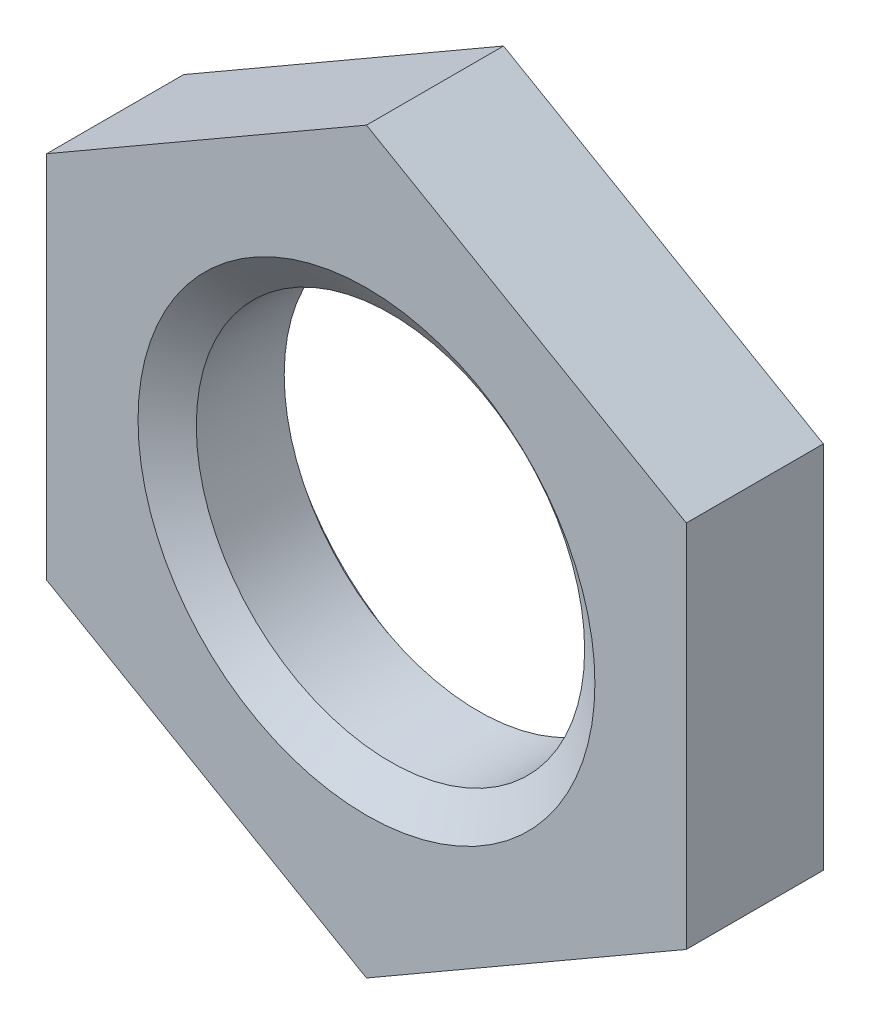
ISO-10303-21;
HEADER;
FILE_DESCRIPTION(('STEP AP214'),'2;1');
FILE_NAME('part.step','',(''),(''),'','','');
FILE_SCHEMA(('AUTOMOTIVE_DESIGN { 1 0 10303 214 1 1 1 1 }'));
ENDSEC;
DATA;
#1=APPLICATION_CONTEXT('core data for automotive mechanical design processes');
#2=APPLICATION_PROTOCOL_DEFINITION('international standard','automotive_design',2000,#1);
#3=PRODUCT_CONTEXT('',#1,'mechanical');
#4=PRODUCT('Part','Part','',(#3));
#5=PRODUCT_RELATED_PRODUCT_CATEGORY('part','',(#4));
#6=PRODUCT_DEFINITION_FORMATION('','',#4);
#7=PRODUCT_DEFINITION_CONTEXT('part definition',#1,'design');
#8=PRODUCT_DEFINITION('design','',#6,#7);
#9=PRODUCT_DEFINITION_SHAPE('','',#8);
#10=(LENGTH_UNIT() NAMED_UNIT(*) SI_UNIT(.MILLI.,.METRE.));
#11=(NAMED_UNIT(*) PLANE_ANGLE_UNIT() SI_UNIT($,.RADIAN.));
#12=(NAMED_UNIT(*) SI_UNIT($,.STERADIAN.) SOLID_ANGLE_UNIT());
#13=UNCERTAINTY_MEASURE_WITH_UNIT(LENGTH_MEASURE(1.E-05),#10,'distance_accuracy_value','');
#14=(GEOMETRIC_REPRESENTATION_CONTEXT(3) GLOBAL_UNCERTAINTY_ASSIGNED_CONTEXT((#13)) GLOBAL_UNIT_ASSIGNED_CONTEXT((#10,
#11,#12)) REPRESENTATION_CONTEXT('',''));
#15=CARTESIAN_POINT('',(0.,0.,0.));
#16=DIRECTION('',(0.,0.,1.));
#17=DIRECTION('',(1.,0.,0.));
#18=AXIS2_PLACEMENT_3D('',#15,#16,#17);
#19=CARTESIAN_POINT('',(0.,0.,-3.));
#20=DIRECTION('',(0.,0.,1.));
#21=DIRECTION('',(1.,0.,0.));
#22=AXIS2_PLACEMENT_3D('',#19,#20,#21);
#23=CYLINDRICAL_SURFACE('',#22,4.25);
#24=CARTESIAN_POINT('',(0.,0.,-0.525155653657273));
#25=DIRECTION('',(0.,0.,1.));
#26=DIRECTION('',(1.,0.,0.));
#27=AXIS2_PLACEMENT_3D('',#24,#25,#26);
#28=CIRCLE('',#27,4.25);
#29=CARTESIAN_POINT('',(4.25,0.,-0.525155653657273));
#30=VERTEX_POINT('',#29);
#31=EDGE_CURVE('E116',#30,#30,#28,.F.);
#32=ORIENTED_EDGE('',*,*,#31,.F.);
#33=EDGE_LOOP('',(#32));
#34=FACE_BOUND('',#33,.T.);
#35=CARTESIAN_POINT('',(0.,0.,-2.44944434634271));
#36=DIRECTION('',(0.,0.,-1.));
#37=DIRECTION('',(-1.,0.,0.));
#38=AXIS2_PLACEMENT_3D('',#35,#36,#37);
#39=CIRCLE('',#38,4.25);
#40=CARTESIAN_POINT('',(-4.25,0.,-2.44944434634271));
#41=VERTEX_POINT('',#40);
#42=EDGE_CURVE('E45',#41,#41,#39,.F.);
#43=ORIENTED_EDGE('',*,*,#42,.F.);
#44=EDGE_LOOP('',(#43));
#45=FACE_BOUND('',#44,.T.);
#46=ADVANCED_FACE('F41',(#34,#45),#23,.F.);
#47=CARTESIAN_POINT('',(0.,8.08290376865476,-3.));
#48=DIRECTION('',(0.,0.,-1.));
#49=DIRECTION('',(-1.,0.,0.));
#50=AXIS2_PLACEMENT_3D('',#47,#48,#49);
#51=PLANE('',#50);
#52=DIRECTION('',(-0.866025403784438,-0.500000000000001,0.));
#53=VECTOR('',#52,1.);
#54=CARTESIAN_POINT('',(0.,8.08290376865476,-3.));
#55=LINE('',#54,#53);
#56=CARTESIAN_POINT('',(0.,8.08290376865476,-3.));
#57=VERTEX_POINT('',#56);
#58=CARTESIAN_POINT('',(-7.,4.04145188432738,-3.));
#59=VERTEX_POINT('',#58);
#60=EDGE_CURVE('E97',#57,#59,#55,.T.);
#61=ORIENTED_EDGE('',*,*,#60,.F.);
#62=DIRECTION('',(-0.866025403784438,0.500000000000001,0.));
#63=VECTOR('',#62,1.);
#64=CARTESIAN_POINT('',(7.,4.04145188432737,-3.));
#65=LINE('',#64,#63);
#66=CARTESIAN_POINT('',(7.,4.04145188432737,-3.));
#67=VERTEX_POINT('',#66);
#68=EDGE_CURVE('E102',#67,#57,#65,.T.);
#69=ORIENTED_EDGE('',*,*,#68,.F.);
#70=DIRECTION('',(0.,-1.,0.));
#71=VECTOR('',#70,1.);
#72=CARTESIAN_POINT('',(7.,4.04145188432737,-3.));
#73=LINE('',#72,#71);
#74=CARTESIAN_POINT('',(7.,-4.04145188432739,-3.));
#75=VERTEX_POINT('',#74);
#76=EDGE_CURVE('E141',#67,#75,#73,.T.);
#77=ORIENTED_EDGE('',*,*,#76,.T.);
#78=DIRECTION('',(0.866025403784438,0.500000000000001,0.));
#79=VECTOR('',#78,1.);
#80=CARTESIAN_POINT('',(0.,-8.08290376865478,-3.));
#81=LINE('',#80,#79);
#82=CARTESIAN_POINT('',(0.,-8.08290376865478,-3.));
#83=VERTEX_POINT('',#82);
#84=EDGE_CURVE('E138',#83,#75,#81,.T.);
#85=ORIENTED_EDGE('',*,*,#84,.F.);
#86=DIRECTION('',(0.866025403784438,-0.500000000000001,0.));
#87=VECTOR('',#86,1.);
#88=CARTESIAN_POINT('',(-7.,-4.04145188432739,-3.));
#89=LINE('',#88,#87);
#90=CARTESIAN_POINT('',(-7.,-4.04145188432739,-3.));
#91=VERTEX_POINT('',#90);
#92=EDGE_CURVE('E135',#91,#83,#89,.T.);
#93=ORIENTED_EDGE('',*,*,#92,.F.);
#94=DIRECTION('',(0.,-1.,0.));
#95=VECTOR('',#94,1.);
#96=CARTESIAN_POINT('',(-7.,4.04145188432738,-3.));
#97=LINE('',#96,#95);
#98=EDGE_CURVE('E133',#59,#91,#97,.T.);
#99=ORIENTED_EDGE('',*,*,#98,.F.);
#100=EDGE_LOOP('',(#61,#69,#77,#85,#93,#99));
#101=FACE_BOUND('',#100,.T.);
#102=CARTESIAN_POINT('',(0.,0.,-3.));
#103=DIRECTION('',(0.,0.,-1.));
#104=DIRECTION('',(-1.,0.,0.));
#105=AXIS2_PLACEMENT_3D('',#102,#103,#104);
#106=CIRCLE('',#105,5.);
#107=CARTESIAN_POINT('',(-5.,0.,-3.));
#108=VERTEX_POINT('',#107);
#109=EDGE_CURVE('E149',#108,#108,#106,.F.);
#110=ORIENTED_EDGE('',*,*,#109,.T.);
#111=EDGE_LOOP('',(#110));
#112=FACE_BOUND('',#111,.T.);
#113=ADVANCED_FACE('F168',(#101,#112),#51,.T.);
#114=CARTESIAN_POINT('',(0.,8.08290376865476,0.));
#115=DIRECTION('',(0.,0.,-1.));
#116=DIRECTION('',(-1.,0.,0.));
#117=AXIS2_PLACEMENT_3D('',#114,#115,#116);
#118=PLANE('',#117);
#119=DIRECTION('',(-0.866025403784438,-0.500000000000001,0.));
#120=VECTOR('',#119,1.);
#121=CARTESIAN_POINT('',(0.,8.08290376865476,0.));
#122=LINE('',#121,#120);
#123=CARTESIAN_POINT('',(0.,8.08290376865476,0.));
#124=VERTEX_POINT('',#123);
#125=CARTESIAN_POINT('',(-7.,4.04145188432738,0.));
#126=VERTEX_POINT('',#125);
#127=EDGE_CURVE('E95',#124,#126,#122,.T.);
#128=ORIENTED_EDGE('',*,*,#127,.T.);
#129=DIRECTION('',(0.,-1.,0.));
#130=VECTOR('',#129,1.);
#131=CARTESIAN_POINT('',(-7.,4.04145188432738,0.));
#132=LINE('',#131,#130);
#133=CARTESIAN_POINT('',(-7.,-4.04145188432739,0.));
#134=VERTEX_POINT('',#133);
#135=EDGE_CURVE('E105',#126,#134,#132,.T.);
#136=ORIENTED_EDGE('',*,*,#135,.T.);
#137=DIRECTION('',(0.866025403784438,-0.500000000000001,0.));
#138=VECTOR('',#137,1.);
#139=CARTESIAN_POINT('',(-7.,-4.04145188432739,0.));
#140=LINE('',#139,#138);
#141=CARTESIAN_POINT('',(0.,-8.08290376865478,0.));
#142=VERTEX_POINT('',#141);
#143=EDGE_CURVE('E110',#134,#142,#140,.T.);
#144=ORIENTED_EDGE('',*,*,#143,.T.);
#145=DIRECTION('',(0.866025403784438,0.500000000000001,0.));
#146=VECTOR('',#145,1.);
#147=CARTESIAN_POINT('',(0.,-8.08290376865478,0.));
#148=LINE('',#147,#146);
#149=CARTESIAN_POINT('',(7.,-4.04145188432739,0.));
#150=VERTEX_POINT('',#149);
#151=EDGE_CURVE('E125',#142,#150,#148,.T.);
#152=ORIENTED_EDGE('',*,*,#151,.T.);
#153=DIRECTION('',(0.,-1.,0.));
#154=VECTOR('',#153,1.);
#155=CARTESIAN_POINT('',(7.,4.04145188432737,0.));
#156=LINE('',#155,#154);
#157=CARTESIAN_POINT('',(7.,4.04145188432737,0.));
#158=VERTEX_POINT('',#157);
#159=EDGE_CURVE('E128',#158,#150,#156,.T.);
#160=ORIENTED_EDGE('',*,*,#159,.F.);
#161=DIRECTION('',(-0.866025403784438,0.500000000000001,0.));
#162=VECTOR('',#161,1.);
#163=CARTESIAN_POINT('',(7.,4.04145188432737,0.));
#164=LINE('',#163,#162);
#165=EDGE_CURVE('E115',#158,#124,#164,.T.);
#166=ORIENTED_EDGE('',*,*,#165,.T.);
#167=EDGE_LOOP('',(#128,#136,#144,#152,#160,#166));
#168=FACE_BOUND('',#167,.T.);
#169=CARTESIAN_POINT('',(0.,0.,0.));
#170=DIRECTION('',(0.,0.,1.));
#171=DIRECTION('',(1.,0.,0.));
#172=AXIS2_PLACEMENT_3D('',#169,#170,#171);
#173=CIRCLE('',#172,5.);
#174=CARTESIAN_POINT('',(5.,0.,0.));
#175=VERTEX_POINT('',#174);
#176=EDGE_CURVE('E119',#175,#175,#173,.T.);
#177=ORIENTED_EDGE('',*,*,#176,.F.);
#178=EDGE_LOOP('',(#177));
#179=FACE_BOUND('',#178,.T.);
#180=ADVANCED_FACE('F112',(#168,#179),#118,.F.);
#181=CARTESIAN_POINT('',(0.,8.08290376865476,-3.));
#182=DIRECTION('',(-0.500000000000001,0.866025403784438,0.));
#183=DIRECTION('',(-0.866025403784438,-0.500000000000001,0.));
#184=AXIS2_PLACEMENT_3D('',#181,#182,#183);
#185=PLANE('',#184);
#186=ORIENTED_EDGE('',*,*,#127,.F.);
#187=DIRECTION('',(0.,0.,1.));
#188=VECTOR('',#187,1.);
#189=CARTESIAN_POINT('',(0.,8.08290376865476,-3.));
#190=LINE('',#189,#188);
#191=EDGE_CURVE('E11',#57,#124,#190,.T.);
#192=ORIENTED_EDGE('',*,*,#191,.F.);
#193=ORIENTED_EDGE('',*,*,#60,.T.);
#194=DIRECTION('',(0.,0.,1.));
#195=VECTOR('',#194,1.);
#196=CARTESIAN_POINT('',(-7.,4.04145188432738,-3.));
#197=LINE('',#196,#195);
#198=EDGE_CURVE('E92',#59,#126,#197,.T.);
#199=ORIENTED_EDGE('',*,*,#198,.T.);
#200=EDGE_LOOP('',(#186,#192,#193,#199));
#201=FACE_BOUND('',#200,.T.);
#202=ADVANCED_FACE('F43',(#201),#185,.T.);
#203=CARTESIAN_POINT('',(7.,4.04145188432737,-3.));
#204=DIRECTION('',(0.500000000000001,0.866025403784438,0.));
#205=DIRECTION('',(-0.866025403784438,0.500000000000001,0.));
#206=AXIS2_PLACEMENT_3D('',#203,#204,#205);
#207=PLANE('',#206);
#208=ORIENTED_EDGE('',*,*,#165,.F.);
#209=DIRECTION('',(0.,0.,1.));
#210=VECTOR('',#209,1.);
#211=CARTESIAN_POINT('',(7.,4.04145188432737,-3.));
#212=LINE('',#211,#210);
#213=EDGE_CURVE('E50',#67,#158,#212,.T.);
#214=ORIENTED_EDGE('',*,*,#213,.F.);
#215=ORIENTED_EDGE('',*,*,#68,.T.);
#216=ORIENTED_EDGE('',*,*,#191,.T.);
#217=EDGE_LOOP('',(#208,#214,#215,#216));
#218=FACE_BOUND('',#217,.T.);
#219=ADVANCED_FACE('F182',(#218),#207,.T.);
#220=CARTESIAN_POINT('',(7.,4.04145188432737,-3.));
#221=DIRECTION('',(-1.,0.,0.));
#222=DIRECTION('',(0.,0.,1.));
#223=AXIS2_PLACEMENT_3D('',#220,#221,#222);
#224=PLANE('',#223);
#225=ORIENTED_EDGE('',*,*,#159,.T.);
#226=DIRECTION('',(0.,0.,1.));
#227=VECTOR('',#226,1.);
#228=CARTESIAN_POINT('',(7.,-4.04145188432739,-3.));
#229=LINE('',#228,#227);
#230=EDGE_CURVE('E145',#75,#150,#229,.T.);
#231=ORIENTED_EDGE('',*,*,#230,.F.);
#232=ORIENTED_EDGE('',*,*,#76,.F.);
#233=ORIENTED_EDGE('',*,*,#213,.T.);
#234=EDGE_LOOP('',(#225,#231,#232,#233));
#235=FACE_BOUND('',#234,.T.);
#236=ADVANCED_FACE('F185',(#235),#224,.F.);
#237=CARTESIAN_POINT('',(0.,-8.08290376865478,-3.));
#238=DIRECTION('',(0.500000000000001,-0.866025403784438,0.));
#239=DIRECTION('',(0.866025403784438,0.500000000000001,0.));
#240=AXIS2_PLACEMENT_3D('',#237,#238,#239);
#241=PLANE('',#240);
#242=ORIENTED_EDGE('',*,*,#151,.F.);
#243=DIRECTION('',(0.,0.,1.));
#244=VECTOR('',#243,1.);
#245=CARTESIAN_POINT('',(0.,-8.08290376865478,-3.));
#246=LINE('',#245,#244);
#247=EDGE_CURVE('E147',#83,#142,#246,.T.);
#248=ORIENTED_EDGE('',*,*,#247,.F.);
#249=ORIENTED_EDGE('',*,*,#84,.T.);
#250=ORIENTED_EDGE('',*,*,#230,.T.);
#251=EDGE_LOOP('',(#242,#248,#249,#250));
#252=FACE_BOUND('',#251,.T.);
#253=ADVANCED_FACE('F188',(#252),#241,.T.);
#254=CARTESIAN_POINT('',(-7.,-4.04145188432739,-3.));
#255=DIRECTION('',(-0.500000000000001,-0.866025403784438,0.));
#256=DIRECTION('',(0.866025403784438,-0.500000000000001,0.));
#257=AXIS2_PLACEMENT_3D('',#254,#255,#256);
#258=PLANE('',#257);
#259=ORIENTED_EDGE('',*,*,#143,.F.);
#260=DIRECTION('',(0.,0.,1.));
#261=VECTOR('',#260,1.);
#262=CARTESIAN_POINT('',(-7.,-4.04145188432739,-3.));
#263=LINE('',#262,#261);
#264=EDGE_CURVE('E101',#91,#134,#263,.T.);
#265=ORIENTED_EDGE('',*,*,#264,.F.);
#266=ORIENTED_EDGE('',*,*,#92,.T.);
#267=ORIENTED_EDGE('',*,*,#247,.T.);
#268=EDGE_LOOP('',(#259,#265,#266,#267));
#269=FACE_BOUND('',#268,.T.);
#270=ADVANCED_FACE('F192',(#269),#258,.T.);
#271=CARTESIAN_POINT('',(-7.,4.04145188432738,-3.));
#272=DIRECTION('',(-1.,0.,0.));
#273=DIRECTION('',(0.,0.,1.));
#274=AXIS2_PLACEMENT_3D('',#271,#272,#273);
#275=PLANE('',#274);
#276=ORIENTED_EDGE('',*,*,#135,.F.);
#277=ORIENTED_EDGE('',*,*,#198,.F.);
#278=ORIENTED_EDGE('',*,*,#98,.T.);
#279=ORIENTED_EDGE('',*,*,#264,.T.);
#280=EDGE_LOOP('',(#276,#277,#278,#279));
#281=FACE_BOUND('',#280,.T.);
#282=ADVANCED_FACE('F106',(#281),#275,.T.);
#283=CARTESIAN_POINT('',(0.,0.,-0.577671219022999));
#284=DIRECTION('',(0.,0.,1.));
#285=DIRECTION('',(1.,0.,0.));
#286=AXIS2_PLACEMENT_3D('',#283,#284,#285);
#287=CONICAL_SURFACE('',#286,4.175,0.959931088596887);
#288=ORIENTED_EDGE('',*,*,#176,.T.);
#289=EDGE_LOOP('',(#288));
#290=FACE_BOUND('',#289,.T.);
#291=ORIENTED_EDGE('',*,*,#31,.T.);
#292=EDGE_LOOP('',(#291));
#293=FACE_BOUND('',#292,.T.);
#294=ADVANCED_FACE('F163',(#290,#293),#287,.F.);
#295=CARTESIAN_POINT('',(0.,0.,-2.9746));
#296=DIRECTION('',(0.,0.,-1.));
#297=DIRECTION('',(-1.,0.,0.));
#298=AXIS2_PLACEMENT_3D('',#295,#296,#297);
#299=CONICAL_SURFACE('',#298,5.,0.959931088596881);
#300=CARTESIAN_POINT('',(0.,0.,-2.9746));
#301=DIRECTION('',(0.,0.,1.));
#302=DIRECTION('',(1.,0.,0.));
#303=AXIS2_PLACEMENT_3D('',#300,#301,#302);
#304=CIRCLE('',#303,5.);
#305=CARTESIAN_POINT('',(5.,0.,-2.9746));
#306=VERTEX_POINT('',#305);
#307=EDGE_CURVE('E151',#306,#306,#304,.T.);
#308=ORIENTED_EDGE('',*,*,#307,.F.);
#309=EDGE_LOOP('',(#308));
#310=FACE_BOUND('',#309,.T.);
#311=ORIENTED_EDGE('',*,*,#42,.T.);
#312=EDGE_LOOP('',(#311));
#313=FACE_BOUND('',#312,.T.);
#314=ADVANCED_FACE('F160',(#310,#313),#299,.F.);
#315=CARTESIAN_POINT('',(0.,0.,-25.0375057290932));
#316=DIRECTION('',(0.,0.,1.));
#317=DIRECTION('',(1.,0.,0.));
#318=AXIS2_PLACEMENT_3D('',#315,#316,#317);
#319=CYLINDRICAL_SURFACE('',#318,5.);
#320=ORIENTED_EDGE('',*,*,#109,.F.);
#321=EDGE_LOOP('',(#320));
#322=FACE_BOUND('',#321,.T.);
#323=ORIENTED_EDGE('',*,*,#307,.T.);
#324=EDGE_LOOP('',(#323));
#325=FACE_BOUND('',#324,.T.);
#326=ADVANCED_FACE('F158',(#322,#325),#319,.F.);
#327=CLOSED_SHELL('',(#46,#113,#180,#202,#219,#236,#253,#270,#282,#294,#314,#326));
#328=MANIFOLD_SOLID_BREP('B2',#327);
#329=ADVANCED_BREP_SHAPE_REPRESENTATION('',(#18,#328),#14);
#330=SHAPE_DEFINITION_REPRESENTATION(#9,#329);
ENDSEC;
END-ISO-10303-21;
